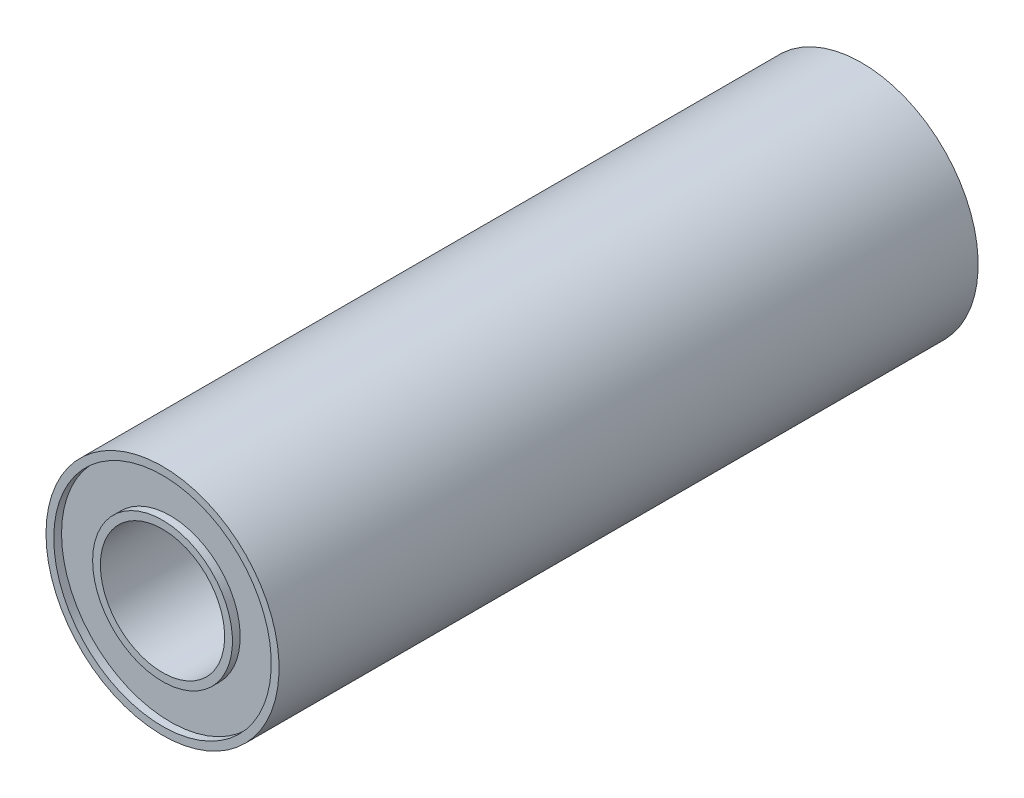
ISO-10303-21;
HEADER;
FILE_DESCRIPTION(('STEP AP214'),'2;1');
FILE_NAME('part.step','',(''),(''),'','','');
FILE_SCHEMA(('AUTOMOTIVE_DESIGN { 1 0 10303 214 1 1 1 1 }'));
ENDSEC;
DATA;
#1=APPLICATION_CONTEXT('core data for automotive mechanical design processes');
#2=APPLICATION_PROTOCOL_DEFINITION('international standard','automotive_design',2000,#1);
#3=PRODUCT_CONTEXT('',#1,'mechanical');
#4=PRODUCT('Part','Part','',(#3));
#5=PRODUCT_RELATED_PRODUCT_CATEGORY('part','',(#4));
#6=PRODUCT_DEFINITION_FORMATION('','',#4);
#7=PRODUCT_DEFINITION_CONTEXT('part definition',#1,'design');
#8=PRODUCT_DEFINITION('design','',#6,#7);
#9=PRODUCT_DEFINITION_SHAPE('','',#8);
#10=(LENGTH_UNIT() NAMED_UNIT(*) SI_UNIT(.MILLI.,.METRE.));
#11=(NAMED_UNIT(*) PLANE_ANGLE_UNIT() SI_UNIT($,.RADIAN.));
#12=(NAMED_UNIT(*) SI_UNIT($,.STERADIAN.) SOLID_ANGLE_UNIT());
#13=UNCERTAINTY_MEASURE_WITH_UNIT(LENGTH_MEASURE(1.E-05),#10,'distance_accuracy_value','');
#14=(GEOMETRIC_REPRESENTATION_CONTEXT(3) GLOBAL_UNCERTAINTY_ASSIGNED_CONTEXT((#13)) GLOBAL_UNIT_ASSIGNED_CONTEXT((#10,
#11,#12)) REPRESENTATION_CONTEXT('',''));
#15=CARTESIAN_POINT('',(0.,0.,0.));
#16=DIRECTION('',(0.,0.,1.));
#17=DIRECTION('',(1.,0.,0.));
#18=AXIS2_PLACEMENT_3D('',#15,#16,#17);
#19=CARTESIAN_POINT('',(0.,0.,22.5));
#20=DIRECTION('',(0.,0.,-1.));
#21=DIRECTION('',(-1.,0.,0.));
#22=AXIS2_PLACEMENT_3D('',#19,#20,#21);
#23=CYLINDRICAL_SURFACE('',#22,7.);
#24=CARTESIAN_POINT('',(0.,0.,-22.5));
#25=DIRECTION('',(0.,0.,1.));
#26=DIRECTION('',(1.,0.,0.));
#27=AXIS2_PLACEMENT_3D('',#24,#25,#26);
#28=CIRCLE('',#27,7.);
#29=CARTESIAN_POINT('',(-7.,0.,-22.5));
#30=VERTEX_POINT('',#29);
#31=EDGE_CURVE('E64',#30,#30,#28,.T.);
#32=CARTESIAN_POINT('',(0.,0.,-22.));
#33=DIRECTION('',(0.,0.,1.));
#34=DIRECTION('',(1.,0.,0.));
#35=AXIS2_PLACEMENT_3D('',#32,#33,#34);
#36=CIRCLE('',#35,7.);
#37=CARTESIAN_POINT('',(-7.,0.,-22.));
#38=VERTEX_POINT('',#37);
#39=EDGE_CURVE('E97',#38,#38,#36,.T.);
#40=CARTESIAN_POINT('',(-7.,0.,-22.5));
#41=CARTESIAN_POINT('',(-7.,0.,-22.4947916666667));
#42=CARTESIAN_POINT('',(-7.,0.,-22.4895833333333));
#43=CARTESIAN_POINT('',(-7.,0.,-22.4791666666667));
#44=CARTESIAN_POINT('',(-7.,0.,-22.4739583333333));
#45=CARTESIAN_POINT('',(-7.,0.,-22.4635416666667));
#46=CARTESIAN_POINT('',(-7.,0.,-22.4583333333333));
#47=CARTESIAN_POINT('',(-7.,0.,-22.4479166666667));
#48=CARTESIAN_POINT('',(-7.,0.,-22.4427083333333));
#49=CARTESIAN_POINT('',(-7.,0.,-22.4322916666667));
#50=CARTESIAN_POINT('',(-7.,0.,-22.4270833333333));
#51=CARTESIAN_POINT('',(-7.,0.,-22.4166666666667));
#52=CARTESIAN_POINT('',(-7.,0.,-22.4114583333333));
#53=CARTESIAN_POINT('',(-7.,0.,-22.4010416666667));
#54=CARTESIAN_POINT('',(-7.,0.,-22.3958333333333));
#55=CARTESIAN_POINT('',(-7.,0.,-22.3854166666667));
#56=CARTESIAN_POINT('',(-7.,0.,-22.3802083333333));
#57=CARTESIAN_POINT('',(-7.,0.,-22.3697916666667));
#58=CARTESIAN_POINT('',(-7.,0.,-22.3645833333333));
#59=CARTESIAN_POINT('',(-7.,0.,-22.3541666666667));
#60=CARTESIAN_POINT('',(-7.,0.,-22.3489583333333));
#61=CARTESIAN_POINT('',(-7.,0.,-22.3385416666667));
#62=CARTESIAN_POINT('',(-7.,0.,-22.3333333333333));
#63=CARTESIAN_POINT('',(-7.,0.,-22.3229166666667));
#64=CARTESIAN_POINT('',(-7.,0.,-22.3177083333333));
#65=CARTESIAN_POINT('',(-7.,0.,-22.3072916666667));
#66=CARTESIAN_POINT('',(-7.,0.,-22.3020833333333));
#67=CARTESIAN_POINT('',(-7.,0.,-22.2916666666667));
#68=CARTESIAN_POINT('',(-7.,0.,-22.2864583333333));
#69=CARTESIAN_POINT('',(-7.,0.,-22.2760416666667));
#70=CARTESIAN_POINT('',(-7.,0.,-22.2708333333333));
#71=CARTESIAN_POINT('',(-7.,0.,-22.2604166666667));
#72=CARTESIAN_POINT('',(-7.,0.,-22.2552083333333));
#73=CARTESIAN_POINT('',(-7.,0.,-22.2447916666667));
#74=CARTESIAN_POINT('',(-7.,0.,-22.2395833333333));
#75=CARTESIAN_POINT('',(-7.,0.,-22.2291666666667));
#76=CARTESIAN_POINT('',(-7.,0.,-22.2239583333333));
#77=CARTESIAN_POINT('',(-7.,0.,-22.2135416666667));
#78=CARTESIAN_POINT('',(-7.,0.,-22.2083333333333));
#79=CARTESIAN_POINT('',(-7.,0.,-22.1979166666667));
#80=CARTESIAN_POINT('',(-7.,0.,-22.1927083333333));
#81=CARTESIAN_POINT('',(-7.,0.,-22.1822916666667));
#82=CARTESIAN_POINT('',(-7.,0.,-22.1770833333333));
#83=CARTESIAN_POINT('',(-7.,0.,-22.1666666666667));
#84=CARTESIAN_POINT('',(-7.,0.,-22.1614583333333));
#85=CARTESIAN_POINT('',(-7.,0.,-22.1510416666667));
#86=CARTESIAN_POINT('',(-7.,0.,-22.1458333333333));
#87=CARTESIAN_POINT('',(-7.,0.,-22.1354166666667));
#88=CARTESIAN_POINT('',(-7.,0.,-22.1302083333333));
#89=CARTESIAN_POINT('',(-7.,0.,-22.1197916666667));
#90=CARTESIAN_POINT('',(-7.,0.,-22.1145833333333));
#91=CARTESIAN_POINT('',(-7.,0.,-22.1041666666667));
#92=CARTESIAN_POINT('',(-7.,0.,-22.0989583333333));
#93=CARTESIAN_POINT('',(-7.,0.,-22.0885416666667));
#94=CARTESIAN_POINT('',(-7.,0.,-22.0833333333333));
#95=CARTESIAN_POINT('',(-7.,0.,-22.0729166666667));
#96=CARTESIAN_POINT('',(-7.,0.,-22.0677083333333));
#97=CARTESIAN_POINT('',(-7.,0.,-22.0572916666667));
#98=CARTESIAN_POINT('',(-7.,0.,-22.0520833333333));
#99=CARTESIAN_POINT('',(-7.,0.,-22.0416666666667));
#100=CARTESIAN_POINT('',(-7.,0.,-22.0364583333333));
#101=CARTESIAN_POINT('',(-7.,0.,-22.0260416666667));
#102=CARTESIAN_POINT('',(-7.,0.,-22.0208333333333));
#103=CARTESIAN_POINT('',(-7.,0.,-22.0104166666667));
#104=CARTESIAN_POINT('',(-7.,0.,-22.0052083333333));
#105=CARTESIAN_POINT('',(-7.,0.,-22.));
#106=B_SPLINE_CURVE_WITH_KNOTS('',3,(#40,#41,#42,#43,#44,#45,#46,#47,#48,#49,#50,#51,#52,#53,
#54,#55,#56,#57,#58,#59,#60,#61,#62,#63,#64,#65,#66,#67,#68,#69,#70,#71,#72,#73,#74,#75,#76,#77,
#78,#79,#80,#81,#82,#83,#84,#85,#86,#87,#88,#89,#90,#91,#92,#93,#94,#95,#96,#97,#98,#99,#100,
#101,#102,#103,#104,#105),.UNSPECIFIED.,.F.,.F.,(4,2,2,2,2,2,2,2,2,2,2,2,2,2,2,2,2,2,2,2,2,2,2,
2,2,2,2,2,2,2,2,2,4),(0.,0.0156249999999983,0.0312499999999966,0.0468750000000018,
0.0625000000000001,0.0781249999999983,0.0937500000000036,0.109375000000002,0.125,
0.140624999999998,0.156249999999997,0.171875000000002,0.1875,0.203124999999998,
0.218750000000004,0.234375000000002,0.25,0.265624999999999,0.281249999999997,0.296875000000002,
0.3125,0.328124999999999,0.343750000000004,0.359375000000002,0.375,0.390624999999999,
0.406249999999997,0.421875000000002,0.4375,0.453124999999999,0.468750000000004,
0.484375000000002,0.5),.UNSPECIFIED.);
#107=EDGE_CURVE('BSEAM44',#30,#38,#106,.T.);
#108=ORIENTED_EDGE('',*,*,#31,.F.);
#109=ORIENTED_EDGE('',*,*,#39,.T.);
#110=ORIENTED_EDGE('',*,*,#107,.T.);
#111=ORIENTED_EDGE('',*,*,#107,.F.);
#112=EDGE_LOOP('',(#108,#110,#109,#111));
#113=FACE_BOUND('',#112,.T.);
#114=ADVANCED_FACE('F44',(#113),#23,.F.);
#115=CARTESIAN_POINT('',(0.,0.,22.));
#116=DIRECTION('',(0.,0.,1.));
#117=DIRECTION('',(1.,0.,0.));
#118=AXIS2_PLACEMENT_3D('',#115,#116,#117);
#119=CIRCLE('',#118,7.);
#120=CARTESIAN_POINT('',(-7.,0.,22.));
#121=VERTEX_POINT('',#120);
#122=EDGE_CURVE('E11',#121,#121,#119,.T.);
#123=CARTESIAN_POINT('',(0.,0.,22.5));
#124=DIRECTION('',(0.,0.,1.));
#125=DIRECTION('',(1.,0.,0.));
#126=AXIS2_PLACEMENT_3D('',#123,#124,#125);
#127=CIRCLE('',#126,7.);
#128=CARTESIAN_POINT('',(-7.,0.,22.5));
#129=VERTEX_POINT('',#128);
#130=EDGE_CURVE('E55',#129,#129,#127,.T.);
#131=CARTESIAN_POINT('',(-7.,0.,22.));
#132=CARTESIAN_POINT('',(-7.,0.,22.0052083333333));
#133=CARTESIAN_POINT('',(-7.,0.,22.0104166666667));
#134=CARTESIAN_POINT('',(-7.,0.,22.0208333333333));
#135=CARTESIAN_POINT('',(-7.,0.,22.0260416666667));
#136=CARTESIAN_POINT('',(-7.,0.,22.0364583333333));
#137=CARTESIAN_POINT('',(-7.,0.,22.0416666666667));
#138=CARTESIAN_POINT('',(-7.,0.,22.0520833333333));
#139=CARTESIAN_POINT('',(-7.,0.,22.0572916666667));
#140=CARTESIAN_POINT('',(-7.,0.,22.0677083333333));
#141=CARTESIAN_POINT('',(-7.,0.,22.0729166666667));
#142=CARTESIAN_POINT('',(-7.,0.,22.0833333333333));
#143=CARTESIAN_POINT('',(-7.,0.,22.0885416666667));
#144=CARTESIAN_POINT('',(-7.,0.,22.0989583333333));
#145=CARTESIAN_POINT('',(-7.,0.,22.1041666666667));
#146=CARTESIAN_POINT('',(-7.,0.,22.1145833333333));
#147=CARTESIAN_POINT('',(-7.,0.,22.1197916666667));
#148=CARTESIAN_POINT('',(-7.,0.,22.1302083333333));
#149=CARTESIAN_POINT('',(-7.,0.,22.1354166666667));
#150=CARTESIAN_POINT('',(-7.,0.,22.1458333333333));
#151=CARTESIAN_POINT('',(-7.,0.,22.1510416666667));
#152=CARTESIAN_POINT('',(-7.,0.,22.1614583333333));
#153=CARTESIAN_POINT('',(-7.,0.,22.1666666666667));
#154=CARTESIAN_POINT('',(-7.,0.,22.1770833333333));
#155=CARTESIAN_POINT('',(-7.,0.,22.1822916666667));
#156=CARTESIAN_POINT('',(-7.,0.,22.1927083333333));
#157=CARTESIAN_POINT('',(-7.,0.,22.1979166666667));
#158=CARTESIAN_POINT('',(-7.,0.,22.2083333333333));
#159=CARTESIAN_POINT('',(-7.,0.,22.2135416666667));
#160=CARTESIAN_POINT('',(-7.,0.,22.2239583333333));
#161=CARTESIAN_POINT('',(-7.,0.,22.2291666666667));
#162=CARTESIAN_POINT('',(-7.,0.,22.2395833333333));
#163=CARTESIAN_POINT('',(-7.,0.,22.2447916666667));
#164=CARTESIAN_POINT('',(-7.,0.,22.2552083333333));
#165=CARTESIAN_POINT('',(-7.,0.,22.2604166666667));
#166=CARTESIAN_POINT('',(-7.,0.,22.2708333333333));
#167=CARTESIAN_POINT('',(-7.,0.,22.2760416666667));
#168=CARTESIAN_POINT('',(-7.,0.,22.2864583333333));
#169=CARTESIAN_POINT('',(-7.,0.,22.2916666666667));
#170=CARTESIAN_POINT('',(-7.,0.,22.3020833333333));
#171=CARTESIAN_POINT('',(-7.,0.,22.3072916666667));
#172=CARTESIAN_POINT('',(-7.,0.,22.3177083333333));
#173=CARTESIAN_POINT('',(-7.,0.,22.3229166666667));
#174=CARTESIAN_POINT('',(-7.,0.,22.3333333333333));
#175=CARTESIAN_POINT('',(-7.,0.,22.3385416666667));
#176=CARTESIAN_POINT('',(-7.,0.,22.3489583333333));
#177=CARTESIAN_POINT('',(-7.,0.,22.3541666666667));
#178=CARTESIAN_POINT('',(-7.,0.,22.3645833333333));
#179=CARTESIAN_POINT('',(-7.,0.,22.3697916666667));
#180=CARTESIAN_POINT('',(-7.,0.,22.3802083333333));
#181=CARTESIAN_POINT('',(-7.,0.,22.3854166666667));
#182=CARTESIAN_POINT('',(-7.,0.,22.3958333333333));
#183=CARTESIAN_POINT('',(-7.,0.,22.4010416666667));
#184=CARTESIAN_POINT('',(-7.,0.,22.4114583333333));
#185=CARTESIAN_POINT('',(-7.,0.,22.4166666666667));
#186=CARTESIAN_POINT('',(-7.,0.,22.4270833333333));
#187=CARTESIAN_POINT('',(-7.,0.,22.4322916666667));
#188=CARTESIAN_POINT('',(-7.,0.,22.4427083333333));
#189=CARTESIAN_POINT('',(-7.,0.,22.4479166666667));
#190=CARTESIAN_POINT('',(-7.,0.,22.4583333333333));
#191=CARTESIAN_POINT('',(-7.,0.,22.4635416666667));
#192=CARTESIAN_POINT('',(-7.,0.,22.4739583333333));
#193=CARTESIAN_POINT('',(-7.,0.,22.4791666666667));
#194=CARTESIAN_POINT('',(-7.,0.,22.4895833333333));
#195=CARTESIAN_POINT('',(-7.,0.,22.4947916666667));
#196=CARTESIAN_POINT('',(-7.,0.,22.5));
#197=B_SPLINE_CURVE_WITH_KNOTS('',3,(#131,#132,#133,#134,#135,#136,#137,#138,#139,#140,#141,
#142,#143,#144,#145,#146,#147,#148,#149,#150,#151,#152,#153,#154,#155,#156,#157,#158,#159,#160,
#161,#162,#163,#164,#165,#166,#167,#168,#169,#170,#171,#172,#173,#174,#175,#176,#177,#178,#179,
#180,#181,#182,#183,#184,#185,#186,#187,#188,#189,#190,#191,#192,#193,#194,#195,#196),
.UNSPECIFIED.,.F.,.F.,(4,2,2,2,2,2,2,2,2,2,2,2,2,2,2,2,2,2,2,2,2,2,2,2,2,2,2,2,2,2,2,2,4),(0.,
0.0156250000000017,0.03125,0.0468750000000018,0.0625000000000001,0.0781250000000018,
0.0937500000000001,0.109375000000002,0.125,0.140625000000002,0.15625,0.171875000000002,0.1875,
0.203125000000002,0.21875,0.234375000000002,0.25,0.265625000000002,0.28125,0.296875000000002,
0.3125,0.328125000000002,0.34375,0.359375000000002,0.375,0.390625000000002,0.40625,
0.421875000000002,0.437500000000004,0.453125000000002,0.468750000000004,0.484375000000002,
0.500000000000004),.UNSPECIFIED.);
#198=EDGE_CURVE('BSEAM46',#121,#129,#197,.T.);
#199=ORIENTED_EDGE('',*,*,#122,.F.);
#200=ORIENTED_EDGE('',*,*,#130,.T.);
#201=ORIENTED_EDGE('',*,*,#198,.T.);
#202=ORIENTED_EDGE('',*,*,#198,.F.);
#203=EDGE_LOOP('',(#199,#201,#200,#202));
#204=FACE_BOUND('',#203,.T.);
#205=ADVANCED_FACE('F46',(#204),#23,.F.);
#206=CARTESIAN_POINT('',(0.,0.,22.5));
#207=DIRECTION('',(0.,0.,-1.));
#208=DIRECTION('',(-1.,0.,0.));
#209=AXIS2_PLACEMENT_3D('',#206,#207,#208);
#210=CYLINDRICAL_SURFACE('',#209,7.5);
#211=CARTESIAN_POINT('',(0.,0.,22.5));
#212=DIRECTION('',(0.,0.,1.));
#213=DIRECTION('',(1.,0.,0.));
#214=AXIS2_PLACEMENT_3D('',#211,#212,#213);
#215=CIRCLE('',#214,7.5);
#216=CARTESIAN_POINT('',(-7.5,0.,22.5));
#217=VERTEX_POINT('',#216);
#218=EDGE_CURVE('E51',#217,#217,#215,.T.);
#219=CARTESIAN_POINT('',(0.,0.,-22.5));
#220=DIRECTION('',(0.,0.,1.));
#221=DIRECTION('',(1.,0.,0.));
#222=AXIS2_PLACEMENT_3D('',#219,#220,#221);
#223=CIRCLE('',#222,7.5);
#224=CARTESIAN_POINT('',(-7.5,0.,-22.5));
#225=VERTEX_POINT('',#224);
#226=EDGE_CURVE('E60',#225,#225,#223,.T.);
#227=CARTESIAN_POINT('',(-7.5,0.,22.5));
#228=CARTESIAN_POINT('',(-7.5,0.,22.03125));
#229=CARTESIAN_POINT('',(-7.5,0.,21.5625));
#230=CARTESIAN_POINT('',(-7.5,0.,20.625));
#231=CARTESIAN_POINT('',(-7.5,0.,20.15625));
#232=CARTESIAN_POINT('',(-7.5,0.,19.21875));
#233=CARTESIAN_POINT('',(-7.5,0.,18.75));
#234=CARTESIAN_POINT('',(-7.5,0.,17.8125));
#235=CARTESIAN_POINT('',(-7.5,0.,17.34375));
#236=CARTESIAN_POINT('',(-7.5,0.,16.40625));
#237=CARTESIAN_POINT('',(-7.5,0.,15.9375));
#238=CARTESIAN_POINT('',(-7.5,0.,15.));
#239=CARTESIAN_POINT('',(-7.5,0.,14.53125));
#240=CARTESIAN_POINT('',(-7.5,0.,13.59375));
#241=CARTESIAN_POINT('',(-7.5,0.,13.125));
#242=CARTESIAN_POINT('',(-7.5,0.,12.1875));
#243=CARTESIAN_POINT('',(-7.5,0.,11.71875));
#244=CARTESIAN_POINT('',(-7.5,0.,10.78125));
#245=CARTESIAN_POINT('',(-7.5,0.,10.3125));
#246=CARTESIAN_POINT('',(-7.5,0.,9.37499999999999));
#247=CARTESIAN_POINT('',(-7.5,0.,8.90625));
#248=CARTESIAN_POINT('',(-7.5,0.,7.96874999999999));
#249=CARTESIAN_POINT('',(-7.5,0.,7.5));
#250=CARTESIAN_POINT('',(-7.5,0.,6.5625));
#251=CARTESIAN_POINT('',(-7.5,0.,6.09374999999999));
#252=CARTESIAN_POINT('',(-7.5,0.,5.15624999999999));
#253=CARTESIAN_POINT('',(-7.5,0.,4.68749999999999));
#254=CARTESIAN_POINT('',(-7.5,0.,3.74999999999999));
#255=CARTESIAN_POINT('',(-7.5,0.,3.28124999999999));
#256=CARTESIAN_POINT('',(-7.5,0.,2.34375));
#257=CARTESIAN_POINT('',(-7.5,0.,1.87499999999999));
#258=CARTESIAN_POINT('',(-7.5,0.,0.937499999999994));
#259=CARTESIAN_POINT('',(-7.5,0.,0.468749999999993));
#260=CARTESIAN_POINT('',(-7.5,0.,-0.468750000000007));
#261=CARTESIAN_POINT('',(-7.5,0.,-0.937500000000008));
#262=CARTESIAN_POINT('',(-7.5,0.,-1.87500000000001));
#263=CARTESIAN_POINT('',(-7.5,0.,-2.34375000000001));
#264=CARTESIAN_POINT('',(-7.5,0.,-3.28125000000001));
#265=CARTESIAN_POINT('',(-7.5,0.,-3.75000000000001));
#266=CARTESIAN_POINT('',(-7.5,0.,-4.68750000000001));
#267=CARTESIAN_POINT('',(-7.5,0.,-5.15625000000001));
#268=CARTESIAN_POINT('',(-7.5,0.,-6.09375000000001));
#269=CARTESIAN_POINT('',(-7.5,0.,-6.56250000000001));
#270=CARTESIAN_POINT('',(-7.5,0.,-7.50000000000001));
#271=CARTESIAN_POINT('',(-7.5,0.,-7.96875000000001));
#272=CARTESIAN_POINT('',(-7.5,0.,-8.90625000000001));
#273=CARTESIAN_POINT('',(-7.5,0.,-9.37500000000001));
#274=CARTESIAN_POINT('',(-7.5,0.,-10.3125));
#275=CARTESIAN_POINT('',(-7.5,0.,-10.78125));
#276=CARTESIAN_POINT('',(-7.5,0.,-11.71875));
#277=CARTESIAN_POINT('',(-7.5,0.,-12.1875));
#278=CARTESIAN_POINT('',(-7.5,0.,-13.125));
#279=CARTESIAN_POINT('',(-7.5,0.,-13.59375));
#280=CARTESIAN_POINT('',(-7.5,0.,-14.53125));
#281=CARTESIAN_POINT('',(-7.5,0.,-15.));
#282=CARTESIAN_POINT('',(-7.5,0.,-15.9375));
#283=CARTESIAN_POINT('',(-7.5,0.,-16.40625));
#284=CARTESIAN_POINT('',(-7.5,0.,-17.34375));
#285=CARTESIAN_POINT('',(-7.5,0.,-17.8125));
#286=CARTESIAN_POINT('',(-7.5,0.,-18.75));
#287=CARTESIAN_POINT('',(-7.5,0.,-19.21875));
#288=CARTESIAN_POINT('',(-7.5,0.,-20.15625));
#289=CARTESIAN_POINT('',(-7.5,0.,-20.625));
#290=CARTESIAN_POINT('',(-7.5,0.,-21.5625));
#291=CARTESIAN_POINT('',(-7.5,0.,-22.03125));
#292=CARTESIAN_POINT('',(-7.5,0.,-22.5));
#293=B_SPLINE_CURVE_WITH_KNOTS('',3,(#227,#228,#229,#230,#231,#232,#233,#234,#235,#236,#237,
#238,#239,#240,#241,#242,#243,#244,#245,#246,#247,#248,#249,#250,#251,#252,#253,#254,#255,#256,
#257,#258,#259,#260,#261,#262,#263,#264,#265,#266,#267,#268,#269,#270,#271,#272,#273,#274,#275,
#276,#277,#278,#279,#280,#281,#282,#283,#284,#285,#286,#287,#288,#289,#290,#291,#292),
.UNSPECIFIED.,.F.,.F.,(4,2,2,2,2,2,2,2,2,2,2,2,2,2,2,2,2,2,2,2,2,2,2,2,2,2,2,2,2,2,2,2,4),(0.,
1.40625,2.8125,4.21875,5.625,7.03125,8.4375,9.84375,11.25,12.65625,14.0625,15.46875,16.875,
18.28125,19.6875,21.09375,22.5,23.90625,25.3125,26.71875,28.125,29.53125,30.9375,32.34375,33.75,
35.15625,36.5625,37.96875,39.375,40.78125,42.1875,43.59375,45.),.UNSPECIFIED.);
#294=EDGE_CURVE('BSEAM70',#217,#225,#293,.T.);
#295=ORIENTED_EDGE('',*,*,#218,.F.);
#296=ORIENTED_EDGE('',*,*,#226,.T.);
#297=ORIENTED_EDGE('',*,*,#294,.T.);
#298=ORIENTED_EDGE('',*,*,#294,.F.);
#299=EDGE_LOOP('',(#295,#297,#296,#298));
#300=FACE_BOUND('',#299,.T.);
#301=ADVANCED_FACE('F70',(#300),#210,.T.);
#302=CARTESIAN_POINT('',(0.,0.,22.5));
#303=DIRECTION('',(0.,0.,1.));
#304=DIRECTION('',(1.,0.,0.));
#305=AXIS2_PLACEMENT_3D('',#302,#303,#304);
#306=PLANE('',#305);
#307=ORIENTED_EDGE('',*,*,#130,.F.);
#308=EDGE_LOOP('',(#307));
#309=FACE_BOUND('',#308,.T.);
#310=ORIENTED_EDGE('',*,*,#218,.T.);
#311=EDGE_LOOP('',(#310));
#312=FACE_BOUND('',#311,.T.);
#313=ADVANCED_FACE('F75',(#309,#312),#306,.T.);
#314=CARTESIAN_POINT('',(0.,0.,-22.5));
#315=DIRECTION('',(0.,0.,1.));
#316=DIRECTION('',(1.,0.,0.));
#317=AXIS2_PLACEMENT_3D('',#314,#315,#316);
#318=PLANE('',#317);
#319=ORIENTED_EDGE('',*,*,#31,.T.);
#320=EDGE_LOOP('',(#319));
#321=FACE_BOUND('',#320,.T.);
#322=ORIENTED_EDGE('',*,*,#226,.F.);
#323=EDGE_LOOP('',(#322));
#324=FACE_BOUND('',#323,.T.);
#325=ADVANCED_FACE('F72',(#321,#324),#318,.F.);
#326=CARTESIAN_POINT('',(0.,0.,22.));
#327=DIRECTION('',(0.,0.,1.));
#328=DIRECTION('',(1.,0.,0.));
#329=AXIS2_PLACEMENT_3D('',#326,#327,#328);
#330=PLANE('',#329);
#331=CARTESIAN_POINT('',(0.,0.,22.));
#332=DIRECTION('',(0.,0.,1.));
#333=DIRECTION('',(1.,0.,0.));
#334=AXIS2_PLACEMENT_3D('',#331,#332,#333);
#335=CIRCLE('',#334,4.5);
#336=CARTESIAN_POINT('',(-4.5,0.,22.));
#337=VERTEX_POINT('',#336);
#338=EDGE_CURVE('E66',#337,#337,#335,.T.);
#339=ORIENTED_EDGE('',*,*,#338,.F.);
#340=EDGE_LOOP('',(#339));
#341=FACE_BOUND('',#340,.T.);
#342=ORIENTED_EDGE('',*,*,#122,.T.);
#343=EDGE_LOOP('',(#342));
#344=FACE_BOUND('',#343,.T.);
#345=ADVANCED_FACE('F74',(#341,#344),#330,.T.);
#346=CARTESIAN_POINT('',(0.,0.,-22.));
#347=DIRECTION('',(0.,0.,1.));
#348=DIRECTION('',(1.,0.,0.));
#349=AXIS2_PLACEMENT_3D('',#346,#347,#348);
#350=PLANE('',#349);
#351=CARTESIAN_POINT('',(0.,0.,-22.));
#352=DIRECTION('',(0.,0.,1.));
#353=DIRECTION('',(1.,0.,0.));
#354=AXIS2_PLACEMENT_3D('',#351,#352,#353);
#355=CIRCLE('',#354,4.5);
#356=CARTESIAN_POINT('',(-4.5,0.,-22.));
#357=VERTEX_POINT('',#356);
#358=EDGE_CURVE('E99',#357,#357,#355,.F.);
#359=ORIENTED_EDGE('',*,*,#358,.F.);
#360=EDGE_LOOP('',(#359));
#361=FACE_BOUND('',#360,.T.);
#362=ORIENTED_EDGE('',*,*,#39,.F.);
#363=EDGE_LOOP('',(#362));
#364=FACE_BOUND('',#363,.T.);
#365=ADVANCED_FACE('F82',(#361,#364),#350,.F.);
#366=CARTESIAN_POINT('',(0.,0.,22.5));
#367=DIRECTION('',(0.,0.,-1.));
#368=DIRECTION('',(-1.,0.,0.));
#369=AXIS2_PLACEMENT_3D('',#366,#367,#368);
#370=CYLINDRICAL_SURFACE('',#369,4.5);
#371=CARTESIAN_POINT('',(0.,0.,-22.5));
#372=DIRECTION('',(0.,0.,1.));
#373=DIRECTION('',(1.,0.,0.));
#374=AXIS2_PLACEMENT_3D('',#371,#372,#373);
#375=CIRCLE('',#374,4.5);
#376=CARTESIAN_POINT('',(-4.5,0.,-22.5));
#377=VERTEX_POINT('',#376);
#378=EDGE_CURVE('E106',#377,#377,#375,.T.);
#379=CARTESIAN_POINT('',(-4.5,0.,-22.5));
#380=CARTESIAN_POINT('',(-4.5,0.,-22.4947916666667));
#381=CARTESIAN_POINT('',(-4.5,0.,-22.4895833333333));
#382=CARTESIAN_POINT('',(-4.5,0.,-22.4791666666667));
#383=CARTESIAN_POINT('',(-4.5,0.,-22.4739583333333));
#384=CARTESIAN_POINT('',(-4.5,0.,-22.4635416666667));
#385=CARTESIAN_POINT('',(-4.5,0.,-22.4583333333333));
#386=CARTESIAN_POINT('',(-4.5,0.,-22.4479166666667));
#387=CARTESIAN_POINT('',(-4.5,0.,-22.4427083333333));
#388=CARTESIAN_POINT('',(-4.5,0.,-22.4322916666667));
#389=CARTESIAN_POINT('',(-4.5,0.,-22.4270833333333));
#390=CARTESIAN_POINT('',(-4.5,0.,-22.4166666666667));
#391=CARTESIAN_POINT('',(-4.5,0.,-22.4114583333333));
#392=CARTESIAN_POINT('',(-4.5,0.,-22.4010416666667));
#393=CARTESIAN_POINT('',(-4.5,0.,-22.3958333333333));
#394=CARTESIAN_POINT('',(-4.5,0.,-22.3854166666667));
#395=CARTESIAN_POINT('',(-4.5,0.,-22.3802083333333));
#396=CARTESIAN_POINT('',(-4.5,0.,-22.3697916666667));
#397=CARTESIAN_POINT('',(-4.5,0.,-22.3645833333333));
#398=CARTESIAN_POINT('',(-4.5,0.,-22.3541666666667));
#399=CARTESIAN_POINT('',(-4.5,0.,-22.3489583333333));
#400=CARTESIAN_POINT('',(-4.5,0.,-22.3385416666667));
#401=CARTESIAN_POINT('',(-4.5,0.,-22.3333333333333));
#402=CARTESIAN_POINT('',(-4.5,0.,-22.3229166666667));
#403=CARTESIAN_POINT('',(-4.5,0.,-22.3177083333333));
#404=CARTESIAN_POINT('',(-4.5,0.,-22.3072916666667));
#405=CARTESIAN_POINT('',(-4.5,0.,-22.3020833333333));
#406=CARTESIAN_POINT('',(-4.5,0.,-22.2916666666667));
#407=CARTESIAN_POINT('',(-4.5,0.,-22.2864583333333));
#408=CARTESIAN_POINT('',(-4.5,0.,-22.2760416666667));
#409=CARTESIAN_POINT('',(-4.5,0.,-22.2708333333333));
#410=CARTESIAN_POINT('',(-4.5,0.,-22.2604166666667));
#411=CARTESIAN_POINT('',(-4.5,0.,-22.2552083333333));
#412=CARTESIAN_POINT('',(-4.5,0.,-22.2447916666667));
#413=CARTESIAN_POINT('',(-4.5,0.,-22.2395833333333));
#414=CARTESIAN_POINT('',(-4.5,0.,-22.2291666666667));
#415=CARTESIAN_POINT('',(-4.5,0.,-22.2239583333333));
#416=CARTESIAN_POINT('',(-4.5,0.,-22.2135416666667));
#417=CARTESIAN_POINT('',(-4.5,0.,-22.2083333333333));
#418=CARTESIAN_POINT('',(-4.5,0.,-22.1979166666667));
#419=CARTESIAN_POINT('',(-4.5,0.,-22.1927083333333));
#420=CARTESIAN_POINT('',(-4.5,0.,-22.1822916666667));
#421=CARTESIAN_POINT('',(-4.5,0.,-22.1770833333333));
#422=CARTESIAN_POINT('',(-4.5,0.,-22.1666666666667));
#423=CARTESIAN_POINT('',(-4.5,0.,-22.1614583333333));
#424=CARTESIAN_POINT('',(-4.5,0.,-22.1510416666667));
#425=CARTESIAN_POINT('',(-4.5,0.,-22.1458333333333));
#426=CARTESIAN_POINT('',(-4.5,0.,-22.1354166666667));
#427=CARTESIAN_POINT('',(-4.5,0.,-22.1302083333333));
#428=CARTESIAN_POINT('',(-4.5,0.,-22.1197916666667));
#429=CARTESIAN_POINT('',(-4.5,0.,-22.1145833333333));
#430=CARTESIAN_POINT('',(-4.5,0.,-22.1041666666667));
#431=CARTESIAN_POINT('',(-4.5,0.,-22.0989583333333));
#432=CARTESIAN_POINT('',(-4.5,0.,-22.0885416666667));
#433=CARTESIAN_POINT('',(-4.5,0.,-22.0833333333333));
#434=CARTESIAN_POINT('',(-4.5,0.,-22.0729166666667));
#435=CARTESIAN_POINT('',(-4.5,0.,-22.0677083333333));
#436=CARTESIAN_POINT('',(-4.5,0.,-22.0572916666667));
#437=CARTESIAN_POINT('',(-4.5,0.,-22.0520833333333));
#438=CARTESIAN_POINT('',(-4.5,0.,-22.0416666666667));
#439=CARTESIAN_POINT('',(-4.5,0.,-22.0364583333333));
#440=CARTESIAN_POINT('',(-4.5,0.,-22.0260416666667));
#441=CARTESIAN_POINT('',(-4.5,0.,-22.0208333333333));
#442=CARTESIAN_POINT('',(-4.5,0.,-22.0104166666667));
#443=CARTESIAN_POINT('',(-4.5,0.,-22.0052083333333));
#444=CARTESIAN_POINT('',(-4.5,0.,-22.));
#445=B_SPLINE_CURVE_WITH_KNOTS('',3,(#379,#380,#381,#382,#383,#384,#385,#386,#387,#388,#389,
#390,#391,#392,#393,#394,#395,#396,#397,#398,#399,#400,#401,#402,#403,#404,#405,#406,#407,#408,
#409,#410,#411,#412,#413,#414,#415,#416,#417,#418,#419,#420,#421,#422,#423,#424,#425,#426,#427,
#428,#429,#430,#431,#432,#433,#434,#435,#436,#437,#438,#439,#440,#441,#442,#443,#444),
.UNSPECIFIED.,.F.,.F.,(4,2,2,2,2,2,2,2,2,2,2,2,2,2,2,2,2,2,2,2,2,2,2,2,2,2,2,2,2,2,2,2,4),(0.,
0.0156249999999983,0.0312499999999966,0.0468750000000018,0.0625000000000001,0.0781249999999983,
0.0937500000000036,0.109375000000002,0.125,0.140624999999998,0.156249999999997,
0.171875000000002,0.1875,0.203124999999998,0.218750000000004,0.234375000000002,0.25,
0.265624999999999,0.281249999999997,0.296875000000002,0.3125,0.328124999999999,
0.343750000000004,0.359375000000002,0.375,0.390624999999999,0.406249999999997,0.421875000000002,
0.4375,0.453124999999999,0.468750000000004,0.484375000000002,0.5),.UNSPECIFIED.);
#446=EDGE_CURVE('BSEAM132',#377,#357,#445,.T.);
#447=ORIENTED_EDGE('',*,*,#378,.T.);
#448=ORIENTED_EDGE('',*,*,#358,.T.);
#449=ORIENTED_EDGE('',*,*,#446,.T.);
#450=ORIENTED_EDGE('',*,*,#446,.F.);
#451=EDGE_LOOP('',(#447,#449,#448,#450));
#452=FACE_BOUND('',#451,.T.);
#453=ADVANCED_FACE('F132',(#452),#370,.T.);
#454=CARTESIAN_POINT('',(0.,0.,22.5));
#455=DIRECTION('',(0.,0.,-1.));
#456=DIRECTION('',(-1.,0.,0.));
#457=AXIS2_PLACEMENT_3D('',#454,#455,#456);
#458=CYLINDRICAL_SURFACE('',#457,4.);
#459=CARTESIAN_POINT('',(0.,0.,22.5));
#460=DIRECTION('',(0.,0.,1.));
#461=DIRECTION('',(1.,0.,0.));
#462=AXIS2_PLACEMENT_3D('',#459,#460,#461);
#463=CIRCLE('',#462,4.);
#464=CARTESIAN_POINT('',(-4.,0.,22.5));
#465=VERTEX_POINT('',#464);
#466=EDGE_CURVE('E109',#465,#465,#463,.T.);
#467=CARTESIAN_POINT('',(0.,0.,-22.5));
#468=DIRECTION('',(0.,0.,1.));
#469=DIRECTION('',(1.,0.,0.));
#470=AXIS2_PLACEMENT_3D('',#467,#468,#469);
#471=CIRCLE('',#470,4.);
#472=CARTESIAN_POINT('',(-4.,0.,-22.5));
#473=VERTEX_POINT('',#472);
#474=EDGE_CURVE('E110',#473,#473,#471,.T.);
#475=CARTESIAN_POINT('',(-4.,0.,22.5));
#476=CARTESIAN_POINT('',(-4.,0.,22.03125));
#477=CARTESIAN_POINT('',(-4.,0.,21.5625));
#478=CARTESIAN_POINT('',(-4.,0.,20.625));
#479=CARTESIAN_POINT('',(-4.,0.,20.15625));
#480=CARTESIAN_POINT('',(-4.,0.,19.21875));
#481=CARTESIAN_POINT('',(-4.,0.,18.75));
#482=CARTESIAN_POINT('',(-4.,0.,17.8125));
#483=CARTESIAN_POINT('',(-4.,0.,17.34375));
#484=CARTESIAN_POINT('',(-4.,0.,16.40625));
#485=CARTESIAN_POINT('',(-4.,0.,15.9375));
#486=CARTESIAN_POINT('',(-4.,0.,15.));
#487=CARTESIAN_POINT('',(-4.,0.,14.53125));
#488=CARTESIAN_POINT('',(-4.,0.,13.59375));
#489=CARTESIAN_POINT('',(-4.,0.,13.125));
#490=CARTESIAN_POINT('',(-4.,0.,12.1875));
#491=CARTESIAN_POINT('',(-4.,0.,11.71875));
#492=CARTESIAN_POINT('',(-4.,0.,10.78125));
#493=CARTESIAN_POINT('',(-4.,0.,10.3125));
#494=CARTESIAN_POINT('',(-4.,0.,9.37499999999999));
#495=CARTESIAN_POINT('',(-4.,0.,8.90625));
#496=CARTESIAN_POINT('',(-4.,0.,7.96874999999999));
#497=CARTESIAN_POINT('',(-4.,0.,7.5));
#498=CARTESIAN_POINT('',(-4.,0.,6.5625));
#499=CARTESIAN_POINT('',(-4.,0.,6.09375));
#500=CARTESIAN_POINT('',(-4.,0.,5.15625));
#501=CARTESIAN_POINT('',(-4.,0.,4.6875));
#502=CARTESIAN_POINT('',(-4.,0.,3.75));
#503=CARTESIAN_POINT('',(-4.,0.,3.28125));
#504=CARTESIAN_POINT('',(-4.,0.,2.34375));
#505=CARTESIAN_POINT('',(-4.,0.,1.875));
#506=CARTESIAN_POINT('',(-4.,0.,0.937499999999997));
#507=CARTESIAN_POINT('',(-4.,0.,0.468749999999997));
#508=CARTESIAN_POINT('',(-4.,0.,-0.468750000000004));
#509=CARTESIAN_POINT('',(-4.,0.,-0.937500000000004));
#510=CARTESIAN_POINT('',(-4.,0.,-1.87500000000001));
#511=CARTESIAN_POINT('',(-4.,0.,-2.34375000000001));
#512=CARTESIAN_POINT('',(-4.,0.,-3.28125));
#513=CARTESIAN_POINT('',(-4.,0.,-3.75));
#514=CARTESIAN_POINT('',(-4.,0.,-4.6875));
#515=CARTESIAN_POINT('',(-4.,0.,-5.15625));
#516=CARTESIAN_POINT('',(-4.,0.,-6.09375000000001));
#517=CARTESIAN_POINT('',(-4.,0.,-6.56250000000001));
#518=CARTESIAN_POINT('',(-4.,0.,-7.50000000000001));
#519=CARTESIAN_POINT('',(-4.,0.,-7.96875000000001));
#520=CARTESIAN_POINT('',(-4.,0.,-8.90625));
#521=CARTESIAN_POINT('',(-4.,0.,-9.37500000000001));
#522=CARTESIAN_POINT('',(-4.,0.,-10.3125));
#523=CARTESIAN_POINT('',(-4.,0.,-10.78125));
#524=CARTESIAN_POINT('',(-4.,0.,-11.71875));
#525=CARTESIAN_POINT('',(-4.,0.,-12.1875));
#526=CARTESIAN_POINT('',(-4.,0.,-13.125));
#527=CARTESIAN_POINT('',(-4.,0.,-13.59375));
#528=CARTESIAN_POINT('',(-4.,0.,-14.53125));
#529=CARTESIAN_POINT('',(-4.,0.,-15.));
#530=CARTESIAN_POINT('',(-4.,0.,-15.9375));
#531=CARTESIAN_POINT('',(-4.,0.,-16.40625));
#532=CARTESIAN_POINT('',(-4.,0.,-17.34375));
#533=CARTESIAN_POINT('',(-4.,0.,-17.8125));
#534=CARTESIAN_POINT('',(-4.,0.,-18.75));
#535=CARTESIAN_POINT('',(-4.,0.,-19.21875));
#536=CARTESIAN_POINT('',(-4.,0.,-20.15625));
#537=CARTESIAN_POINT('',(-4.,0.,-20.625));
#538=CARTESIAN_POINT('',(-4.,0.,-21.5625));
#539=CARTESIAN_POINT('',(-4.,0.,-22.03125));
#540=CARTESIAN_POINT('',(-4.,0.,-22.5));
#541=B_SPLINE_CURVE_WITH_KNOTS('',3,(#475,#476,#477,#478,#479,#480,#481,#482,#483,#484,#485,
#486,#487,#488,#489,#490,#491,#492,#493,#494,#495,#496,#497,#498,#499,#500,#501,#502,#503,#504,
#505,#506,#507,#508,#509,#510,#511,#512,#513,#514,#515,#516,#517,#518,#519,#520,#521,#522,#523,
#524,#525,#526,#527,#528,#529,#530,#531,#532,#533,#534,#535,#536,#537,#538,#539,#540),
.UNSPECIFIED.,.F.,.F.,(4,2,2,2,2,2,2,2,2,2,2,2,2,2,2,2,2,2,2,2,2,2,2,2,2,2,2,2,2,2,2,2,4),(0.,
1.40625,2.8125,4.21875,5.625,7.03125,8.4375,9.84375,11.25,12.65625,14.0625,15.46875,16.875,
18.28125,19.6875,21.09375,22.5,23.90625,25.3125,26.71875,28.125,29.53125,30.9375,32.34375,33.75,
35.15625,36.5625,37.96875,39.375,40.78125,42.1875,43.59375,45.),.UNSPECIFIED.);
#542=EDGE_CURVE('BSEAM118',#465,#473,#541,.T.);
#543=ORIENTED_EDGE('',*,*,#466,.T.);
#544=ORIENTED_EDGE('',*,*,#474,.F.);
#545=ORIENTED_EDGE('',*,*,#542,.T.);
#546=ORIENTED_EDGE('',*,*,#542,.F.);
#547=EDGE_LOOP('',(#543,#545,#544,#546));
#548=FACE_BOUND('',#547,.T.);
#549=ADVANCED_FACE('F118',(#548),#458,.F.);
#550=CARTESIAN_POINT('',(0.,0.,22.5));
#551=DIRECTION('',(0.,0.,1.));
#552=DIRECTION('',(1.,0.,0.));
#553=AXIS2_PLACEMENT_3D('',#550,#551,#552);
#554=CIRCLE('',#553,4.5);
#555=CARTESIAN_POINT('',(-4.5,0.,22.5));
#556=VERTEX_POINT('',#555);
#557=EDGE_CURVE('E103',#556,#556,#554,.T.);
#558=CARTESIAN_POINT('',(-4.5,0.,22.));
#559=CARTESIAN_POINT('',(-4.5,0.,22.0052083333333));
#560=CARTESIAN_POINT('',(-4.5,0.,22.0104166666667));
#561=CARTESIAN_POINT('',(-4.5,0.,22.0208333333333));
#562=CARTESIAN_POINT('',(-4.5,0.,22.0260416666667));
#563=CARTESIAN_POINT('',(-4.5,0.,22.0364583333333));
#564=CARTESIAN_POINT('',(-4.5,0.,22.0416666666667));
#565=CARTESIAN_POINT('',(-4.5,0.,22.0520833333333));
#566=CARTESIAN_POINT('',(-4.5,0.,22.0572916666667));
#567=CARTESIAN_POINT('',(-4.5,0.,22.0677083333333));
#568=CARTESIAN_POINT('',(-4.5,0.,22.0729166666667));
#569=CARTESIAN_POINT('',(-4.5,0.,22.0833333333333));
#570=CARTESIAN_POINT('',(-4.5,0.,22.0885416666667));
#571=CARTESIAN_POINT('',(-4.5,0.,22.0989583333333));
#572=CARTESIAN_POINT('',(-4.5,0.,22.1041666666667));
#573=CARTESIAN_POINT('',(-4.5,0.,22.1145833333333));
#574=CARTESIAN_POINT('',(-4.5,0.,22.1197916666667));
#575=CARTESIAN_POINT('',(-4.5,0.,22.1302083333333));
#576=CARTESIAN_POINT('',(-4.5,0.,22.1354166666667));
#577=CARTESIAN_POINT('',(-4.5,0.,22.1458333333333));
#578=CARTESIAN_POINT('',(-4.5,0.,22.1510416666667));
#579=CARTESIAN_POINT('',(-4.5,0.,22.1614583333333));
#580=CARTESIAN_POINT('',(-4.5,0.,22.1666666666667));
#581=CARTESIAN_POINT('',(-4.5,0.,22.1770833333333));
#582=CARTESIAN_POINT('',(-4.5,0.,22.1822916666667));
#583=CARTESIAN_POINT('',(-4.5,0.,22.1927083333333));
#584=CARTESIAN_POINT('',(-4.5,0.,22.1979166666667));
#585=CARTESIAN_POINT('',(-4.5,0.,22.2083333333333));
#586=CARTESIAN_POINT('',(-4.5,0.,22.2135416666667));
#587=CARTESIAN_POINT('',(-4.5,0.,22.2239583333333));
#588=CARTESIAN_POINT('',(-4.5,0.,22.2291666666667));
#589=CARTESIAN_POINT('',(-4.5,0.,22.2395833333333));
#590=CARTESIAN_POINT('',(-4.5,0.,22.2447916666667));
#591=CARTESIAN_POINT('',(-4.5,0.,22.2552083333333));
#592=CARTESIAN_POINT('',(-4.5,0.,22.2604166666667));
#593=CARTESIAN_POINT('',(-4.5,0.,22.2708333333333));
#594=CARTESIAN_POINT('',(-4.5,0.,22.2760416666667));
#595=CARTESIAN_POINT('',(-4.5,0.,22.2864583333333));
#596=CARTESIAN_POINT('',(-4.5,0.,22.2916666666667));
#597=CARTESIAN_POINT('',(-4.5,0.,22.3020833333333));
#598=CARTESIAN_POINT('',(-4.5,0.,22.3072916666667));
#599=CARTESIAN_POINT('',(-4.5,0.,22.3177083333333));
#600=CARTESIAN_POINT('',(-4.5,0.,22.3229166666667));
#601=CARTESIAN_POINT('',(-4.5,0.,22.3333333333333));
#602=CARTESIAN_POINT('',(-4.5,0.,22.3385416666667));
#603=CARTESIAN_POINT('',(-4.5,0.,22.3489583333333));
#604=CARTESIAN_POINT('',(-4.5,0.,22.3541666666667));
#605=CARTESIAN_POINT('',(-4.5,0.,22.3645833333333));
#606=CARTESIAN_POINT('',(-4.5,0.,22.3697916666667));
#607=CARTESIAN_POINT('',(-4.5,0.,22.3802083333333));
#608=CARTESIAN_POINT('',(-4.5,0.,22.3854166666667));
#609=CARTESIAN_POINT('',(-4.5,0.,22.3958333333333));
#610=CARTESIAN_POINT('',(-4.5,0.,22.4010416666667));
#611=CARTESIAN_POINT('',(-4.5,0.,22.4114583333333));
#612=CARTESIAN_POINT('',(-4.5,0.,22.4166666666667));
#613=CARTESIAN_POINT('',(-4.5,0.,22.4270833333333));
#614=CARTESIAN_POINT('',(-4.5,0.,22.4322916666667));
#615=CARTESIAN_POINT('',(-4.5,0.,22.4427083333333));
#616=CARTESIAN_POINT('',(-4.5,0.,22.4479166666667));
#617=CARTESIAN_POINT('',(-4.5,0.,22.4583333333333));
#618=CARTESIAN_POINT('',(-4.5,0.,22.4635416666667));
#619=CARTESIAN_POINT('',(-4.5,0.,22.4739583333333));
#620=CARTESIAN_POINT('',(-4.5,0.,22.4791666666667));
#621=CARTESIAN_POINT('',(-4.5,0.,22.4895833333333));
#622=CARTESIAN_POINT('',(-4.5,0.,22.4947916666667));
#623=CARTESIAN_POINT('',(-4.5,0.,22.5));
#624=B_SPLINE_CURVE_WITH_KNOTS('',3,(#558,#559,#560,#561,#562,#563,#564,#565,#566,#567,#568,
#569,#570,#571,#572,#573,#574,#575,#576,#577,#578,#579,#580,#581,#582,#583,#584,#585,#586,#587,
#588,#589,#590,#591,#592,#593,#594,#595,#596,#597,#598,#599,#600,#601,#602,#603,#604,#605,#606,
#607,#608,#609,#610,#611,#612,#613,#614,#615,#616,#617,#618,#619,#620,#621,#622,#623),
.UNSPECIFIED.,.F.,.F.,(4,2,2,2,2,2,2,2,2,2,2,2,2,2,2,2,2,2,2,2,2,2,2,2,2,2,2,2,2,2,2,2,4),(0.,
0.0156250000000017,0.03125,0.0468750000000018,0.0625000000000001,0.0781250000000018,
0.0937500000000001,0.109375000000002,0.125,0.140625000000002,0.15625,0.171875000000002,0.1875,
0.203125000000002,0.21875,0.234375000000002,0.25,0.265625000000002,0.28125,0.296875000000002,
0.3125,0.328125000000002,0.34375,0.359375000000002,0.375,0.390625000000002,0.40625,
0.421875000000002,0.437500000000004,0.453125000000002,0.468750000000004,0.484375000000002,
0.500000000000004),.UNSPECIFIED.);
#625=EDGE_CURVE('BSEAM125',#337,#556,#624,.T.);
#626=ORIENTED_EDGE('',*,*,#338,.T.);
#627=ORIENTED_EDGE('',*,*,#557,.F.);
#628=ORIENTED_EDGE('',*,*,#625,.T.);
#629=ORIENTED_EDGE('',*,*,#625,.F.);
#630=EDGE_LOOP('',(#626,#628,#627,#629));
#631=FACE_BOUND('',#630,.T.);
#632=ADVANCED_FACE('F125',(#631),#370,.T.);
#633=CARTESIAN_POINT('',(0.,0.,22.5));
#634=DIRECTION('',(0.,0.,1.));
#635=DIRECTION('',(1.,0.,0.));
#636=AXIS2_PLACEMENT_3D('',#633,#634,#635);
#637=PLANE('',#636);
#638=ORIENTED_EDGE('',*,*,#466,.F.);
#639=EDGE_LOOP('',(#638));
#640=FACE_BOUND('',#639,.T.);
#641=ORIENTED_EDGE('',*,*,#557,.T.);
#642=EDGE_LOOP('',(#641));
#643=FACE_BOUND('',#642,.T.);
#644=ADVANCED_FACE('F121',(#640,#643),#637,.T.);
#645=CARTESIAN_POINT('',(0.,0.,-22.5));
#646=DIRECTION('',(0.,0.,1.));
#647=DIRECTION('',(1.,0.,0.));
#648=AXIS2_PLACEMENT_3D('',#645,#646,#647);
#649=PLANE('',#648);
#650=ORIENTED_EDGE('',*,*,#474,.T.);
#651=EDGE_LOOP('',(#650));
#652=FACE_BOUND('',#651,.T.);
#653=ORIENTED_EDGE('',*,*,#378,.F.);
#654=EDGE_LOOP('',(#653));
#655=FACE_BOUND('',#654,.T.);
#656=ADVANCED_FACE('F124',(#652,#655),#649,.F.);
#657=CLOSED_SHELL('',(#114,#205,#301,#313,#325,#345,#365,#453,#549,#632,#644,#656));
#658=MANIFOLD_SOLID_BREP('B2',#657);
#659=ADVANCED_BREP_SHAPE_REPRESENTATION('',(#18,#658),#14);
#660=SHAPE_DEFINITION_REPRESENTATION(#9,#659);
ENDSEC;
END-ISO-10303-21;
